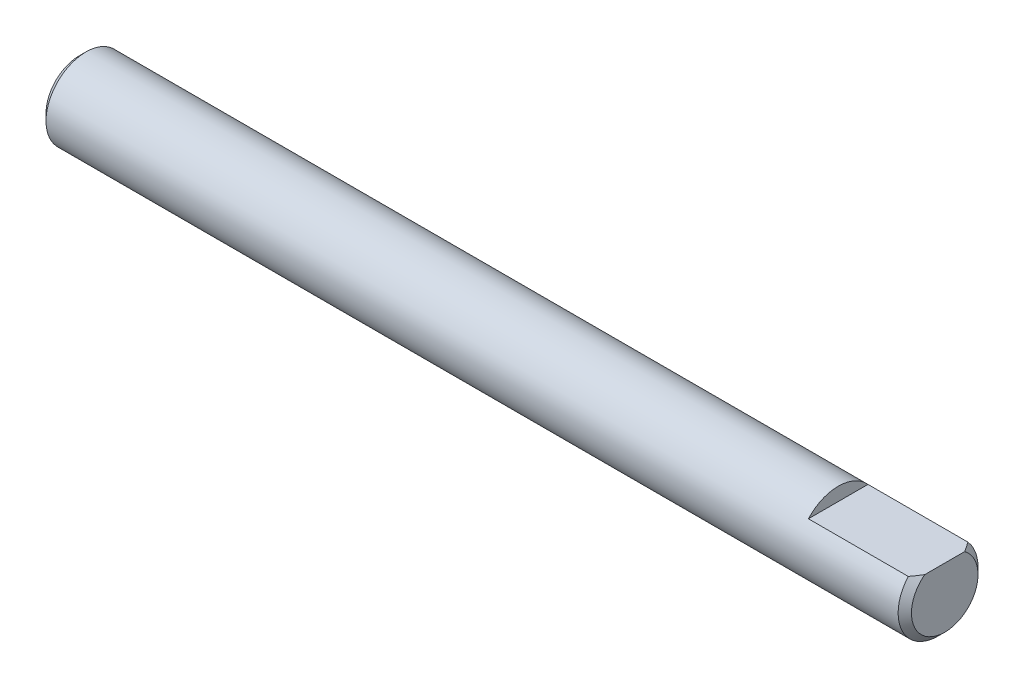
ISO-10303-21;
HEADER;
FILE_DESCRIPTION(('STEP AP214'),'2;1');
FILE_NAME('part.step','',(''),(''),'','','');
FILE_SCHEMA(('AUTOMOTIVE_DESIGN { 1 0 10303 214 1 1 1 1 }'));
ENDSEC;
DATA;
#1=APPLICATION_CONTEXT('core data for automotive mechanical design processes');
#2=APPLICATION_PROTOCOL_DEFINITION('international standard','automotive_design',2000,#1);
#3=PRODUCT_CONTEXT('',#1,'mechanical');
#4=PRODUCT('Part','Part','',(#3));
#5=PRODUCT_RELATED_PRODUCT_CATEGORY('part','',(#4));
#6=PRODUCT_DEFINITION_FORMATION('','',#4);
#7=PRODUCT_DEFINITION_CONTEXT('part definition',#1,'design');
#8=PRODUCT_DEFINITION('design','',#6,#7);
#9=PRODUCT_DEFINITION_SHAPE('','',#8);
#10=(LENGTH_UNIT() NAMED_UNIT(*) SI_UNIT(.MILLI.,.METRE.));
#11=(NAMED_UNIT(*) PLANE_ANGLE_UNIT() SI_UNIT($,.RADIAN.));
#12=(NAMED_UNIT(*) SI_UNIT($,.STERADIAN.) SOLID_ANGLE_UNIT());
#13=UNCERTAINTY_MEASURE_WITH_UNIT(LENGTH_MEASURE(1.E-05),#10,'distance_accuracy_value','');
#14=(GEOMETRIC_REPRESENTATION_CONTEXT(3) GLOBAL_UNCERTAINTY_ASSIGNED_CONTEXT((#13)) GLOBAL_UNIT_ASSIGNED_CONTEXT((#10,
#11,#12)) REPRESENTATION_CONTEXT('',''));
#15=CARTESIAN_POINT('',(0.,0.,0.));
#16=DIRECTION('',(0.,0.,1.));
#17=DIRECTION('',(1.,0.,0.));
#18=AXIS2_PLACEMENT_3D('',#15,#16,#17);
#19=CARTESIAN_POINT('',(32.5,0.,0.));
#20=DIRECTION('',(-1.,0.,0.));
#21=DIRECTION('',(0.,0.,1.));
#22=AXIS2_PLACEMENT_3D('',#19,#20,#21);
#23=CYLINDRICAL_SURFACE('',#22,3.);
#24=CARTESIAN_POINT('',(32.,0.,0.));
#25=DIRECTION('',(1.,0.,0.));
#26=DIRECTION('',(0.,0.,-1.));
#27=AXIS2_PLACEMENT_3D('',#24,#25,#26);
#28=CIRCLE('',#27,3.);
#29=CARTESIAN_POINT('',(32.,2.,-2.23606797749979));
#30=VERTEX_POINT('',#29);
#31=CARTESIAN_POINT('',(32.,2.,2.23606797749979));
#32=VERTEX_POINT('',#31);
#33=EDGE_CURVE('E92',#30,#32,#28,.F.);
#34=ORIENTED_EDGE('',*,*,#33,.T.);
#35=DIRECTION('',(1.,0.,0.));
#36=VECTOR('',#35,1.);
#37=CARTESIAN_POINT('',(24.5,2.,2.23606797749979));
#38=LINE('',#37,#36);
#39=CARTESIAN_POINT('',(24.5,2.,2.23606797749979));
#40=VERTEX_POINT('',#39);
#41=EDGE_CURVE('E85',#40,#32,#38,.T.);
#42=ORIENTED_EDGE('',*,*,#41,.F.);
#43=CARTESIAN_POINT('',(24.5,0.,0.));
#44=DIRECTION('',(1.,0.,0.));
#45=DIRECTION('',(0.,0.,-1.));
#46=AXIS2_PLACEMENT_3D('',#43,#44,#45);
#47=CIRCLE('',#46,3.);
#48=CARTESIAN_POINT('',(24.5,2.,-2.23606797749979));
#49=VERTEX_POINT('',#48);
#50=EDGE_CURVE('E77',#49,#40,#47,.T.);
#51=ORIENTED_EDGE('',*,*,#50,.F.);
#52=DIRECTION('',(1.,0.,0.));
#53=VECTOR('',#52,1.);
#54=CARTESIAN_POINT('',(24.5,2.,-2.23606797749979));
#55=LINE('',#54,#53);
#56=EDGE_CURVE('E87',#49,#30,#55,.T.);
#57=ORIENTED_EDGE('',*,*,#56,.T.);
#58=EDGE_LOOP('',(#34,#42,#51,#57));
#59=FACE_BOUND('',#58,.T.);
#60=CARTESIAN_POINT('',(-32.,0.,0.));
#61=DIRECTION('',(1.,0.,0.));
#62=DIRECTION('',(0.,0.,-1.));
#63=AXIS2_PLACEMENT_3D('',#60,#61,#62);
#64=CIRCLE('',#63,3.);
#65=CARTESIAN_POINT('',(-32.,0.,-3.));
#66=VERTEX_POINT('',#65);
#67=EDGE_CURVE('E100',#66,#66,#64,.T.);
#68=ORIENTED_EDGE('',*,*,#67,.T.);
#69=EDGE_LOOP('',(#68));
#70=FACE_BOUND('',#69,.T.);
#71=ADVANCED_FACE('F40',(#59,#70),#23,.T.);
#72=CARTESIAN_POINT('',(32.5,0.,0.));
#73=DIRECTION('',(1.,0.,0.));
#74=DIRECTION('',(0.,0.,-1.));
#75=AXIS2_PLACEMENT_3D('',#72,#73,#74);
#76=PLANE('',#75);
#77=DIRECTION('',(0.,0.,-1.));
#78=VECTOR('',#77,1.);
#79=CARTESIAN_POINT('',(32.5,2.,2.23606797749979));
#80=LINE('',#79,#78);
#81=CARTESIAN_POINT('',(32.5,2.,1.5));
#82=VERTEX_POINT('',#81);
#83=CARTESIAN_POINT('',(32.5,2.,-1.5));
#84=VERTEX_POINT('',#83);
#85=EDGE_CURVE('E60',#82,#84,#80,.T.);
#86=ORIENTED_EDGE('',*,*,#85,.F.);
#87=CARTESIAN_POINT('',(32.5,0.,0.));
#88=DIRECTION('',(1.,0.,0.));
#89=DIRECTION('',(0.,0.,-1.));
#90=AXIS2_PLACEMENT_3D('',#87,#88,#89);
#91=CIRCLE('',#90,2.5);
#92=EDGE_CURVE('E94',#82,#84,#91,.T.);
#93=ORIENTED_EDGE('',*,*,#92,.T.);
#94=EDGE_LOOP('',(#86,#93));
#95=FACE_BOUND('',#94,.T.);
#96=ADVANCED_FACE('F114',(#95),#76,.T.);
#97=CARTESIAN_POINT('',(-32.5,0.,0.));
#98=DIRECTION('',(1.,0.,0.));
#99=DIRECTION('',(0.,0.,-1.));
#100=AXIS2_PLACEMENT_3D('',#97,#98,#99);
#101=PLANE('',#100);
#102=CARTESIAN_POINT('',(-32.5,0.,0.));
#103=DIRECTION('',(1.,0.,0.));
#104=DIRECTION('',(0.,0.,-1.));
#105=AXIS2_PLACEMENT_3D('',#102,#103,#104);
#106=CIRCLE('',#105,2.50000000000002);
#107=CARTESIAN_POINT('',(-32.5,0.,-2.50000000000002));
#108=VERTEX_POINT('',#107);
#109=EDGE_CURVE('E103',#108,#108,#106,.F.);
#110=ORIENTED_EDGE('',*,*,#109,.T.);
#111=EDGE_LOOP('',(#110));
#112=FACE_BOUND('',#111,.T.);
#113=ADVANCED_FACE('F107',(#112),#101,.F.);
#114=CARTESIAN_POINT('',(32.5,0.,0.));
#115=DIRECTION('',(-1.,0.,0.));
#116=DIRECTION('',(0.,0.,1.));
#117=AXIS2_PLACEMENT_3D('',#114,#115,#116);
#118=CONICAL_SURFACE('',#117,2.5,0.785398163397439);
#119=CARTESIAN_POINT('',(31.9994782145153,2.,2.23676797749979));
#120=CARTESIAN_POINT('',(32.0422945652823,2.,2.17931645268857));
#121=CARTESIAN_POINT('',(32.084656796194,2.,2.12152037696914));
#122=CARTESIAN_POINT('',(32.1682599800212,2.,2.00509634825574));
#123=CARTESIAN_POINT('',(32.2095005764136,2.,1.94646813956711));
#124=CARTESIAN_POINT('',(32.2910214067573,2.,1.82768852965491));
#125=CARTESIAN_POINT('',(32.3312881084611,2.,1.76752779851664));
#126=CARTESIAN_POINT('',(32.4101119974397,2.,1.64610265111674));
#127=CARTESIAN_POINT('',(32.4486693313106,2.,1.5848383301357));
#128=CARTESIAN_POINT('',(32.5256856291619,2.,1.45771243641114));
#129=CARTESIAN_POINT('',(32.5640293025891,2.,1.39178011042579));
#130=CARTESIAN_POINT('',(32.6377575509303,2.,1.25828581300339));
#131=CARTESIAN_POINT('',(32.6731414919955,2.,1.19072349646294));
#132=CARTESIAN_POINT('',(32.7734475797197,2.,0.985763612218088));
#133=CARTESIAN_POINT('',(32.8329117252652,2.,0.845480148457281));
#134=CARTESIAN_POINT('',(32.9030413175397,2.,0.633487549970155));
#135=CARTESIAN_POINT('',(32.9228727632942,2.,0.564804891372619));
#136=CARTESIAN_POINT('',(32.956267646593,2.,0.425893733589023));
#137=CARTESIAN_POINT('',(32.9698308880791,2.,0.355665186122297));
#138=CARTESIAN_POINT('',(32.989596925391,2.,0.215496367488676));
#139=CARTESIAN_POINT('',(32.9959321111608,2.,0.145575091043194));
#140=CARTESIAN_POINT('',(33.001217747754,2.,0.00545223219570114));
#141=CARTESIAN_POINT('',(33.0001687801501,2.,-0.0647493276960649));
#142=CARTESIAN_POINT('',(32.9907737588774,2.,-0.20458637949428));
#143=CARTESIAN_POINT('',(32.9824344121003,2.,-0.274222332326732));
#144=CARTESIAN_POINT('',(32.9590698417753,2.,-0.412354483470248));
#145=CARTESIAN_POINT('',(32.9440432602166,2.,-0.480850447345485));
#146=CARTESIAN_POINT('',(32.9078897099046,2.,-0.617540085672095));
#147=CARTESIAN_POINT('',(32.8866554082516,2.,-0.685704919805908));
#148=CARTESIAN_POINT('',(32.8392434596883,2.,-0.820263369452626));
#149=CARTESIAN_POINT('',(32.8130659015605,2.,-0.886657016752168));
#150=CARTESIAN_POINT('',(32.734020661247,2.,-1.07057309978836));
#151=CARTESIAN_POINT('',(32.6766525177663,2.,-1.18615239314675));
#152=CARTESIAN_POINT('',(32.5532335776654,2.,-1.41269093843218));
#153=CARTESIAN_POINT('',(32.4871675059634,2.,-1.52364159946072));
#154=CARTESIAN_POINT('',(32.3525450410751,2.,-1.73650947938328));
#155=CARTESIAN_POINT('',(32.2842658749354,2.,-1.83860363264849));
#156=CARTESIAN_POINT('',(32.1791812374236,2.,-1.98954938396207));
#157=CARTESIAN_POINT('',(32.1437861691438,2.,-2.03939586029035));
#158=CARTESIAN_POINT('',(32.0721992812735,2.,-2.13850125573186));
#159=CARTESIAN_POINT('',(32.0360075950547,2.,-2.1877602711018));
#160=CARTESIAN_POINT('',(31.9994782145153,2.,-2.23676797749979));
#161=B_SPLINE_CURVE_WITH_KNOTS('',3,(#119,#120,#121,#122,#123,#124,#125,#126,#127,#128,#129,
#130,#131,#132,#133,#134,#135,#136,#137,#138,#139,#140,#141,#142,#143,#144,#145,#146,#147,#148,
#149,#150,#151,#152,#153,#154,#155,#156,#157,#158,#159,#160),.UNSPECIFIED.,.F.,.F.,(4,2,2,2,2,2,
2,2,2,2,2,2,2,2,2,2,2,2,2,2,4),(0.,0.214958978680606,0.42998550410459,0.647138694358496,
0.864273225282067,1.0930073252564,1.32179028558925,1.77718702230425,1.99142116564096,
2.20566200938403,2.41591241099747,2.62614625356696,2.83618689170504,3.04627020334385,
3.26022560669214,3.47417716769921,3.86065495658302,4.2478207545342,4.6161636919667,
4.79956296782567,4.9829317686415),.UNSPECIFIED.);
#162=EDGE_CURVE('E11',#32,#82,#161,.T.);
#163=ORIENTED_EDGE('',*,*,#162,.F.);
#164=ORIENTED_EDGE('',*,*,#33,.F.);
#165=EDGE_CURVE('E45',#84,#30,#161,.T.);
#166=ORIENTED_EDGE('',*,*,#165,.F.);
#167=ORIENTED_EDGE('',*,*,#92,.F.);
#168=EDGE_LOOP('',(#163,#164,#166,#167));
#169=FACE_BOUND('',#168,.T.);
#170=ADVANCED_FACE('F111',(#169),#118,.T.);
#171=CARTESIAN_POINT('',(-32.,0.,0.));
#172=DIRECTION('',(1.,0.,0.));
#173=DIRECTION('',(0.,0.,-1.));
#174=AXIS2_PLACEMENT_3D('',#171,#172,#173);
#175=CONICAL_SURFACE('',#174,3.,0.785398163397446);
#176=ORIENTED_EDGE('',*,*,#109,.F.);
#177=EDGE_LOOP('',(#176));
#178=FACE_BOUND('',#177,.T.);
#179=ORIENTED_EDGE('',*,*,#67,.F.);
#180=EDGE_LOOP('',(#179));
#181=FACE_BOUND('',#180,.T.);
#182=ADVANCED_FACE('F43',(#178,#181),#175,.T.);
#183=CARTESIAN_POINT('',(24.5,2.,2.23606797749979));
#184=DIRECTION('',(0.,-1.,0.));
#185=DIRECTION('',(0.,0.,-1.));
#186=AXIS2_PLACEMENT_3D('',#183,#184,#185);
#187=PLANE('',#186);
#188=ORIENTED_EDGE('',*,*,#162,.T.);
#189=ORIENTED_EDGE('',*,*,#85,.T.);
#190=ORIENTED_EDGE('',*,*,#165,.T.);
#191=ORIENTED_EDGE('',*,*,#56,.F.);
#192=DIRECTION('',(0.,0.,-1.));
#193=VECTOR('',#192,1.);
#194=CARTESIAN_POINT('',(24.5,2.,2.23606797749979));
#195=LINE('',#194,#193);
#196=EDGE_CURVE('E80',#40,#49,#195,.T.);
#197=ORIENTED_EDGE('',*,*,#196,.F.);
#198=ORIENTED_EDGE('',*,*,#41,.T.);
#199=EDGE_LOOP('',(#188,#189,#190,#191,#197,#198));
#200=FACE_BOUND('',#199,.T.);
#201=ADVANCED_FACE('F84',(#200),#187,.F.);
#202=CARTESIAN_POINT('',(24.5,0.,0.));
#203=DIRECTION('',(1.,0.,0.));
#204=DIRECTION('',(0.,0.,-1.));
#205=AXIS2_PLACEMENT_3D('',#202,#203,#204);
#206=PLANE('',#205);
#207=ORIENTED_EDGE('',*,*,#50,.T.);
#208=ORIENTED_EDGE('',*,*,#196,.T.);
#209=EDGE_LOOP('',(#207,#208));
#210=FACE_BOUND('',#209,.T.);
#211=ADVANCED_FACE('F79',(#210),#206,.T.);
#212=CLOSED_SHELL('',(#71,#96,#113,#170,#182,#201,#211));
#213=MANIFOLD_SOLID_BREP('B2',#212);
#214=ADVANCED_BREP_SHAPE_REPRESENTATION('',(#18,#213),#14);
#215=SHAPE_DEFINITION_REPRESENTATION(#9,#214);
ENDSEC;
END-ISO-10303-21;
